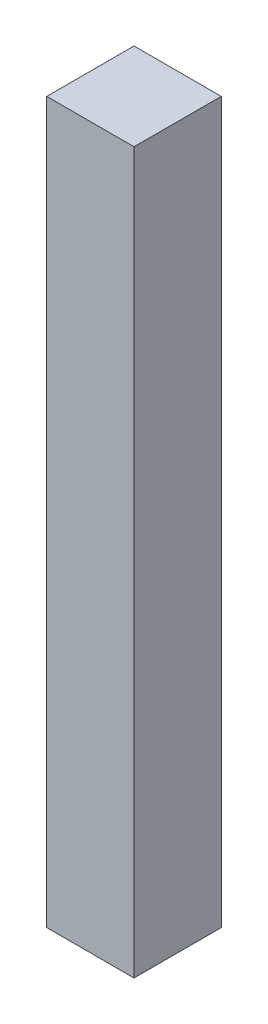
ISO-10303-21;
HEADER;
FILE_DESCRIPTION(('STEP AP214'),'2;1');
FILE_NAME('part.step','',(''),(''),'','','');
FILE_SCHEMA(('AUTOMOTIVE_DESIGN { 1 0 10303 214 1 1 1 1 }'));
ENDSEC;
DATA;
#1=APPLICATION_CONTEXT('core data for automotive mechanical design processes');
#2=APPLICATION_PROTOCOL_DEFINITION('international standard','automotive_design',2000,#1);
#3=PRODUCT_CONTEXT('',#1,'mechanical');
#4=PRODUCT('Part','Part','',(#3));
#5=PRODUCT_RELATED_PRODUCT_CATEGORY('part','',(#4));
#6=PRODUCT_DEFINITION_FORMATION('','',#4);
#7=PRODUCT_DEFINITION_CONTEXT('part definition',#1,'design');
#8=PRODUCT_DEFINITION('design','',#6,#7);
#9=PRODUCT_DEFINITION_SHAPE('','',#8);
#10=(LENGTH_UNIT() NAMED_UNIT(*) SI_UNIT(.MILLI.,.METRE.));
#11=(NAMED_UNIT(*) PLANE_ANGLE_UNIT() SI_UNIT($,.RADIAN.));
#12=(NAMED_UNIT(*) SI_UNIT($,.STERADIAN.) SOLID_ANGLE_UNIT());
#13=UNCERTAINTY_MEASURE_WITH_UNIT(LENGTH_MEASURE(1.E-05),#10,'distance_accuracy_value','');
#14=(GEOMETRIC_REPRESENTATION_CONTEXT(3) GLOBAL_UNCERTAINTY_ASSIGNED_CONTEXT((#13)) GLOBAL_UNIT_ASSIGNED_CONTEXT((#10,
#11,#12)) REPRESENTATION_CONTEXT('',''));
#15=CARTESIAN_POINT('',(0.,0.,0.));
#16=DIRECTION('',(0.,0.,1.));
#17=DIRECTION('',(1.,0.,0.));
#18=AXIS2_PLACEMENT_3D('',#15,#16,#17);
#19=CARTESIAN_POINT('',(40.,660.,-40.));
#20=DIRECTION('',(-1.,0.,0.));
#21=DIRECTION('',(0.,0.,1.));
#22=AXIS2_PLACEMENT_3D('',#19,#20,#21);
#23=PLANE('',#22);
#24=DIRECTION('',(0.,0.,-1.));
#25=VECTOR('',#24,1.);
#26=CARTESIAN_POINT('',(40.,0.,-40.));
#27=LINE('',#26,#25);
#28=CARTESIAN_POINT('',(40.,0.,40.));
#29=VERTEX_POINT('',#28);
#30=CARTESIAN_POINT('',(40.,0.,-40.));
#31=VERTEX_POINT('',#30);
#32=EDGE_CURVE('E100',#29,#31,#27,.T.);
#33=ORIENTED_EDGE('',*,*,#32,.T.);
#34=DIRECTION('',(0.,-1.,0.));
#35=VECTOR('',#34,1.);
#36=CARTESIAN_POINT('',(40.,660.,-40.));
#37=LINE('',#36,#35);
#38=CARTESIAN_POINT('',(40.,660.,-40.));
#39=VERTEX_POINT('',#38);
#40=EDGE_CURVE('E11',#39,#31,#37,.T.);
#41=ORIENTED_EDGE('',*,*,#40,.F.);
#42=DIRECTION('',(0.,0.,-1.));
#43=VECTOR('',#42,1.);
#44=CARTESIAN_POINT('',(40.,660.,-40.));
#45=LINE('',#44,#43);
#46=CARTESIAN_POINT('',(40.,660.,40.));
#47=VERTEX_POINT('',#46);
#48=EDGE_CURVE('E88',#47,#39,#45,.T.);
#49=ORIENTED_EDGE('',*,*,#48,.F.);
#50=DIRECTION('',(0.,-1.,0.));
#51=VECTOR('',#50,1.);
#52=CARTESIAN_POINT('',(40.,660.,40.));
#53=LINE('',#52,#51);
#54=EDGE_CURVE('E96',#47,#29,#53,.T.);
#55=ORIENTED_EDGE('',*,*,#54,.T.);
#56=EDGE_LOOP('',(#33,#41,#49,#55));
#57=FACE_BOUND('',#56,.T.);
#58=ADVANCED_FACE('F37',(#57),#23,.F.);
#59=CARTESIAN_POINT('',(-40.,660.,-40.));
#60=DIRECTION('',(0.,0.,1.));
#61=DIRECTION('',(1.,0.,0.));
#62=AXIS2_PLACEMENT_3D('',#59,#60,#61);
#63=PLANE('',#62);
#64=DIRECTION('',(-1.,0.,0.));
#65=VECTOR('',#64,1.);
#66=CARTESIAN_POINT('',(-40.,0.,-40.));
#67=LINE('',#66,#65);
#68=CARTESIAN_POINT('',(-40.,0.,-40.));
#69=VERTEX_POINT('',#68);
#70=EDGE_CURVE('E92',#31,#69,#67,.T.);
#71=ORIENTED_EDGE('',*,*,#70,.T.);
#72=DIRECTION('',(0.,-1.,0.));
#73=VECTOR('',#72,1.);
#74=CARTESIAN_POINT('',(-40.,660.,-40.));
#75=LINE('',#74,#73);
#76=CARTESIAN_POINT('',(-40.,660.,-40.));
#77=VERTEX_POINT('',#76);
#78=EDGE_CURVE('E45',#77,#69,#75,.T.);
#79=ORIENTED_EDGE('',*,*,#78,.F.);
#80=DIRECTION('',(-1.,0.,0.));
#81=VECTOR('',#80,1.);
#82=CARTESIAN_POINT('',(-40.,660.,-40.));
#83=LINE('',#82,#81);
#84=EDGE_CURVE('E83',#39,#77,#83,.T.);
#85=ORIENTED_EDGE('',*,*,#84,.F.);
#86=ORIENTED_EDGE('',*,*,#40,.T.);
#87=EDGE_LOOP('',(#71,#79,#85,#86));
#88=FACE_BOUND('',#87,.T.);
#89=ADVANCED_FACE('F91',(#88),#63,.F.);
#90=CARTESIAN_POINT('',(-40.,660.,-40.));
#91=DIRECTION('',(1.,0.,0.));
#92=DIRECTION('',(0.,0.,-1.));
#93=AXIS2_PLACEMENT_3D('',#90,#91,#92);
#94=PLANE('',#93);
#95=DIRECTION('',(0.,0.,1.));
#96=VECTOR('',#95,1.);
#97=CARTESIAN_POINT('',(-40.,0.,-40.));
#98=LINE('',#97,#96);
#99=CARTESIAN_POINT('',(-40.,0.,40.));
#100=VERTEX_POINT('',#99);
#101=EDGE_CURVE('E70',#69,#100,#98,.T.);
#102=ORIENTED_EDGE('',*,*,#101,.T.);
#103=DIRECTION('',(0.,-1.,0.));
#104=VECTOR('',#103,1.);
#105=CARTESIAN_POINT('',(-40.,660.,40.));
#106=LINE('',#105,#104);
#107=CARTESIAN_POINT('',(-40.,660.,40.));
#108=VERTEX_POINT('',#107);
#109=EDGE_CURVE('E93',#108,#100,#106,.T.);
#110=ORIENTED_EDGE('',*,*,#109,.F.);
#111=DIRECTION('',(0.,0.,1.));
#112=VECTOR('',#111,1.);
#113=CARTESIAN_POINT('',(-40.,660.,-40.));
#114=LINE('',#113,#112);
#115=EDGE_CURVE('E86',#77,#108,#114,.T.);
#116=ORIENTED_EDGE('',*,*,#115,.F.);
#117=ORIENTED_EDGE('',*,*,#78,.T.);
#118=EDGE_LOOP('',(#102,#110,#116,#117));
#119=FACE_BOUND('',#118,.T.);
#120=ADVANCED_FACE('F94',(#119),#94,.F.);
#121=CARTESIAN_POINT('',(-40.,660.,40.));
#122=DIRECTION('',(0.,0.,-1.));
#123=DIRECTION('',(-1.,0.,0.));
#124=AXIS2_PLACEMENT_3D('',#121,#122,#123);
#125=PLANE('',#124);
#126=DIRECTION('',(1.,0.,0.));
#127=VECTOR('',#126,1.);
#128=CARTESIAN_POINT('',(-40.,0.,40.));
#129=LINE('',#128,#127);
#130=EDGE_CURVE('E76',#100,#29,#129,.T.);
#131=ORIENTED_EDGE('',*,*,#130,.T.);
#132=ORIENTED_EDGE('',*,*,#54,.F.);
#133=DIRECTION('',(1.,0.,0.));
#134=VECTOR('',#133,1.);
#135=CARTESIAN_POINT('',(-40.,660.,40.));
#136=LINE('',#135,#134);
#137=EDGE_CURVE('E53',#108,#47,#136,.T.);
#138=ORIENTED_EDGE('',*,*,#137,.F.);
#139=ORIENTED_EDGE('',*,*,#109,.T.);
#140=EDGE_LOOP('',(#131,#132,#138,#139));
#141=FACE_BOUND('',#140,.T.);
#142=ADVANCED_FACE('F108',(#141),#125,.F.);
#143=CARTESIAN_POINT('',(0.,660.,0.));
#144=DIRECTION('',(0.,1.,0.));
#145=DIRECTION('',(0.,0.,1.));
#146=AXIS2_PLACEMENT_3D('',#143,#144,#145);
#147=PLANE('',#146);
#148=ORIENTED_EDGE('',*,*,#48,.T.);
#149=ORIENTED_EDGE('',*,*,#84,.T.);
#150=ORIENTED_EDGE('',*,*,#115,.T.);
#151=ORIENTED_EDGE('',*,*,#137,.T.);
#152=EDGE_LOOP('',(#148,#149,#150,#151));
#153=FACE_BOUND('',#152,.T.);
#154=ADVANCED_FACE('F84',(#153),#147,.T.);
#155=CARTESIAN_POINT('',(0.,0.,0.));
#156=DIRECTION('',(0.,1.,0.));
#157=DIRECTION('',(0.,0.,1.));
#158=AXIS2_PLACEMENT_3D('',#155,#156,#157);
#159=PLANE('',#158);
#160=CARTESIAN_POINT('',(0.,0.,0.));
#161=DIRECTION('',(0.,-1.,0.));
#162=DIRECTION('',(0.,0.,-1.));
#163=AXIS2_PLACEMENT_3D('',#160,#161,#162);
#164=CIRCLE('',#163,9.);
#165=CARTESIAN_POINT('',(0.,0.,-9.));
#166=VERTEX_POINT('',#165);
#167=EDGE_CURVE('E114',#166,#166,#164,.T.);
#168=ORIENTED_EDGE('',*,*,#167,.F.);
#169=EDGE_LOOP('',(#168));
#170=FACE_BOUND('',#169,.T.);
#171=ORIENTED_EDGE('',*,*,#32,.F.);
#172=ORIENTED_EDGE('',*,*,#130,.F.);
#173=ORIENTED_EDGE('',*,*,#101,.F.);
#174=ORIENTED_EDGE('',*,*,#70,.F.);
#175=EDGE_LOOP('',(#171,#172,#173,#174));
#176=FACE_BOUND('',#175,.T.);
#177=ADVANCED_FACE('F111',(#170,#176),#159,.F.);
#178=CARTESIAN_POINT('',(0.,590.,0.));
#179=DIRECTION('',(0.,-1.,0.));
#180=DIRECTION('',(0.,0.,-1.));
#181=AXIS2_PLACEMENT_3D('',#178,#179,#180);
#182=CYLINDRICAL_SURFACE('',#181,9.);
#183=CARTESIAN_POINT('',(0.,590.,0.));
#184=DIRECTION('',(0.,-1.,0.));
#185=DIRECTION('',(0.,0.,-1.));
#186=AXIS2_PLACEMENT_3D('',#183,#184,#185);
#187=CIRCLE('',#186,9.);
#188=CARTESIAN_POINT('',(0.,590.,-9.));
#189=VERTEX_POINT('',#188);
#190=EDGE_CURVE('E103',#189,#189,#187,.T.);
#191=ORIENTED_EDGE('',*,*,#190,.F.);
#192=EDGE_LOOP('',(#191));
#193=FACE_BOUND('',#192,.T.);
#194=ORIENTED_EDGE('',*,*,#167,.T.);
#195=EDGE_LOOP('',(#194));
#196=FACE_BOUND('',#195,.T.);
#197=ADVANCED_FACE('F122',(#193,#196),#182,.F.);
#198=CARTESIAN_POINT('',(0.,590.,0.));
#199=DIRECTION('',(0.,-1.,0.));
#200=DIRECTION('',(0.,0.,-1.));
#201=AXIS2_PLACEMENT_3D('',#198,#199,#200);
#202=PLANE('',#201);
#203=ORIENTED_EDGE('',*,*,#190,.T.);
#204=EDGE_LOOP('',(#203));
#205=FACE_BOUND('',#204,.T.);
#206=ADVANCED_FACE('F120',(#205),#202,.T.);
#207=CLOSED_SHELL('',(#58,#89,#120,#142,#154,#177,#197,#206));
#208=MANIFOLD_SOLID_BREP('B2',#207);
#209=ADVANCED_BREP_SHAPE_REPRESENTATION('',(#18,#208),#14);
#210=SHAPE_DEFINITION_REPRESENTATION(#9,#209);
ENDSEC;
END-ISO-10303-21;
